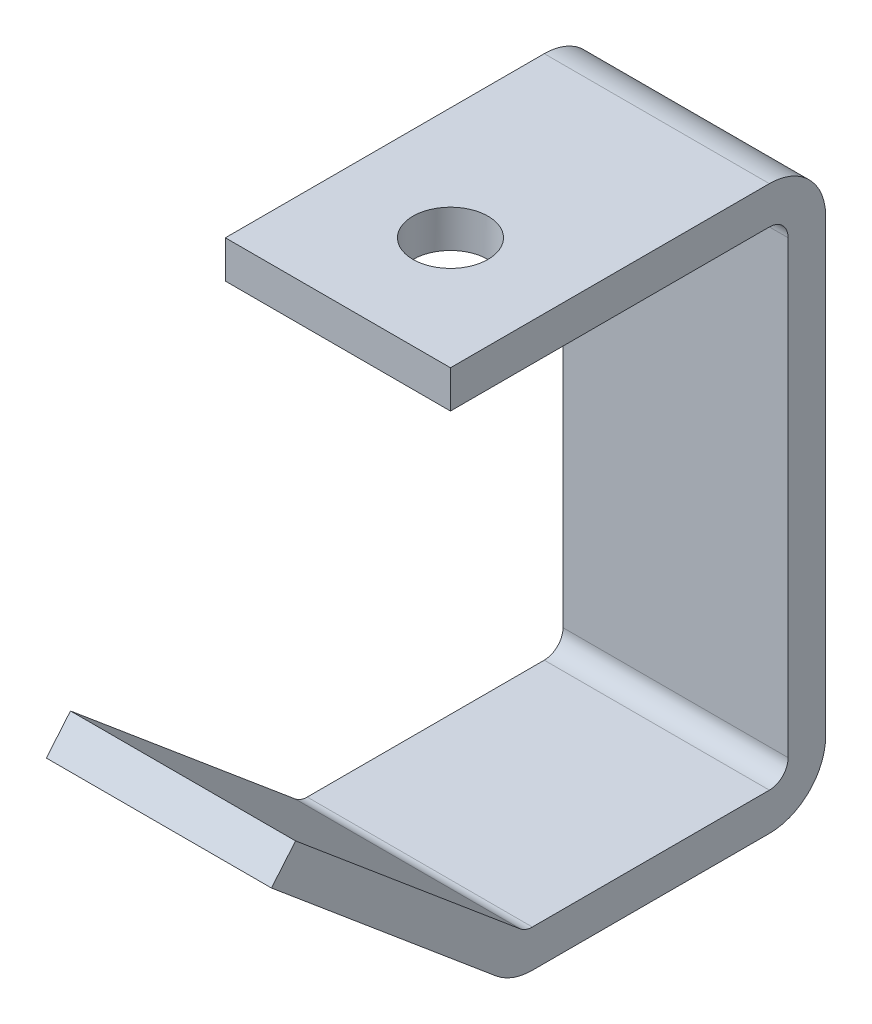
ISO-10303-21;
HEADER;
FILE_DESCRIPTION(('STEP AP214'),'2;1');
FILE_NAME('part.step','',(''),(''),'','','');
FILE_SCHEMA(('AUTOMOTIVE_DESIGN { 1 0 10303 214 1 1 1 1 }'));
ENDSEC;
DATA;
#1=APPLICATION_CONTEXT('core data for automotive mechanical design processes');
#2=APPLICATION_PROTOCOL_DEFINITION('international standard','automotive_design',2000,#1);
#3=PRODUCT_CONTEXT('',#1,'mechanical');
#4=PRODUCT('Part','Part','',(#3));
#5=PRODUCT_RELATED_PRODUCT_CATEGORY('part','',(#4));
#6=PRODUCT_DEFINITION_FORMATION('','',#4);
#7=PRODUCT_DEFINITION_CONTEXT('part definition',#1,'design');
#8=PRODUCT_DEFINITION('design','',#6,#7);
#9=PRODUCT_DEFINITION_SHAPE('','',#8);
#10=(LENGTH_UNIT() NAMED_UNIT(*) SI_UNIT(.MILLI.,.METRE.));
#11=(NAMED_UNIT(*) PLANE_ANGLE_UNIT() SI_UNIT($,.RADIAN.));
#12=(NAMED_UNIT(*) SI_UNIT($,.STERADIAN.) SOLID_ANGLE_UNIT());
#13=UNCERTAINTY_MEASURE_WITH_UNIT(LENGTH_MEASURE(1.E-05),#10,'distance_accuracy_value','');
#14=(GEOMETRIC_REPRESENTATION_CONTEXT(3) GLOBAL_UNCERTAINTY_ASSIGNED_CONTEXT((#13)) GLOBAL_UNIT_ASSIGNED_CONTEXT((#10,
#11,#12)) REPRESENTATION_CONTEXT('',''));
#15=CARTESIAN_POINT('',(0.,0.,0.));
#16=DIRECTION('',(0.,0.,1.));
#17=DIRECTION('',(1.,0.,0.));
#18=AXIS2_PLACEMENT_3D('',#15,#16,#17);
#19=CARTESIAN_POINT('',(19.05,88.9,3.175));
#20=DIRECTION('',(0.,-1.,0.));
#21=DIRECTION('',(0.,0.,-1.));
#22=AXIS2_PLACEMENT_3D('',#19,#20,#21);
#23=PLANE('',#22);
#24=CARTESIAN_POINT('',(0.,88.9,38.1));
#25=DIRECTION('',(0.,1.,0.));
#26=DIRECTION('',(0.,0.,1.));
#27=AXIS2_PLACEMENT_3D('',#24,#25,#26);
#28=CIRCLE('',#27,6.35);
#29=CARTESIAN_POINT('',(0.,88.9,44.45));
#30=VERTEX_POINT('',#29);
#31=EDGE_CURVE('E179',#30,#30,#28,.T.);
#32=ORIENTED_EDGE('',*,*,#31,.F.);
#33=EDGE_LOOP('',(#32));
#34=FACE_BOUND('',#33,.T.);
#35=DIRECTION('',(0.,0.,1.));
#36=VECTOR('',#35,1.);
#37=CARTESIAN_POINT('',(-19.05,88.9,3.175));
#38=LINE('',#37,#36);
#39=CARTESIAN_POINT('',(-19.05,88.9,3.175));
#40=VERTEX_POINT('',#39);
#41=CARTESIAN_POINT('',(-19.05,88.9,57.15));
#42=VERTEX_POINT('',#41);
#43=EDGE_CURVE('E175',#40,#42,#38,.T.);
#44=ORIENTED_EDGE('',*,*,#43,.T.);
#45=DIRECTION('',(-1.,0.,0.));
#46=VECTOR('',#45,1.);
#47=CARTESIAN_POINT('',(19.05,88.9,57.15));
#48=LINE('',#47,#46);
#49=CARTESIAN_POINT('',(19.05,88.9,57.15));
#50=VERTEX_POINT('',#49);
#51=EDGE_CURVE('E11',#50,#42,#48,.T.);
#52=ORIENTED_EDGE('',*,*,#51,.F.);
#53=DIRECTION('',(0.,0.,1.));
#54=VECTOR('',#53,1.);
#55=CARTESIAN_POINT('',(19.05,88.9,3.175));
#56=LINE('',#55,#54);
#57=CARTESIAN_POINT('',(19.05,88.9,3.175));
#58=VERTEX_POINT('',#57);
#59=EDGE_CURVE('E112',#58,#50,#56,.T.);
#60=ORIENTED_EDGE('',*,*,#59,.F.);
#61=DIRECTION('',(-1.,0.,0.));
#62=VECTOR('',#61,1.);
#63=CARTESIAN_POINT('',(19.05,88.9,3.175));
#64=LINE('',#63,#62);
#65=EDGE_CURVE('E171',#58,#40,#64,.T.);
#66=ORIENTED_EDGE('',*,*,#65,.T.);
#67=EDGE_LOOP('',(#44,#52,#60,#66));
#68=FACE_BOUND('',#67,.T.);
#69=ADVANCED_FACE('F32',(#34,#68),#23,.F.);
#70=CARTESIAN_POINT('',(19.05,82.55,57.15));
#71=DIRECTION('',(0.,0.,1.));
#72=DIRECTION('',(1.,0.,0.));
#73=AXIS2_PLACEMENT_3D('',#70,#71,#72);
#74=PLANE('',#73);
#75=DIRECTION('',(0.,1.,0.));
#76=VECTOR('',#75,1.);
#77=CARTESIAN_POINT('',(-19.05,82.55,57.15));
#78=LINE('',#77,#76);
#79=CARTESIAN_POINT('',(-19.05,82.55,57.15));
#80=VERTEX_POINT('',#79);
#81=EDGE_CURVE('E178',#80,#42,#78,.T.);
#82=ORIENTED_EDGE('',*,*,#81,.F.);
#83=DIRECTION('',(-1.,0.,0.));
#84=VECTOR('',#83,1.);
#85=CARTESIAN_POINT('',(19.05,82.55,57.15));
#86=LINE('',#85,#84);
#87=CARTESIAN_POINT('',(19.05,82.55,57.15));
#88=VERTEX_POINT('',#87);
#89=EDGE_CURVE('E40',#88,#80,#86,.T.);
#90=ORIENTED_EDGE('',*,*,#89,.F.);
#91=DIRECTION('',(0.,1.,0.));
#92=VECTOR('',#91,1.);
#93=CARTESIAN_POINT('',(19.05,82.55,57.15));
#94=LINE('',#93,#92);
#95=EDGE_CURVE('E261',#88,#50,#94,.T.);
#96=ORIENTED_EDGE('',*,*,#95,.T.);
#97=ORIENTED_EDGE('',*,*,#51,.T.);
#98=EDGE_LOOP('',(#82,#90,#96,#97));
#99=FACE_BOUND('',#98,.T.);
#100=ADVANCED_FACE('F248',(#99),#74,.T.);
#101=CARTESIAN_POINT('',(19.05,82.55,3.175));
#102=DIRECTION('',(0.,-1.,0.));
#103=DIRECTION('',(0.,0.,-1.));
#104=AXIS2_PLACEMENT_3D('',#101,#102,#103);
#105=PLANE('',#104);
#106=CARTESIAN_POINT('',(0.,82.55,38.1));
#107=DIRECTION('',(0.,-1.,0.));
#108=DIRECTION('',(0.,0.,-1.));
#109=AXIS2_PLACEMENT_3D('',#106,#107,#108);
#110=CIRCLE('',#109,6.35);
#111=CARTESIAN_POINT('',(0.,82.55,31.75));
#112=VERTEX_POINT('',#111);
#113=EDGE_CURVE('E317',#112,#112,#110,.F.);
#114=ORIENTED_EDGE('',*,*,#113,.T.);
#115=EDGE_LOOP('',(#114));
#116=FACE_BOUND('',#115,.T.);
#117=DIRECTION('',(0.,0.,1.));
#118=VECTOR('',#117,1.);
#119=CARTESIAN_POINT('',(-19.05,82.55,3.175));
#120=LINE('',#119,#118);
#121=CARTESIAN_POINT('',(-19.05,82.55,3.175));
#122=VERTEX_POINT('',#121);
#123=EDGE_CURVE('E182',#122,#80,#120,.T.);
#124=ORIENTED_EDGE('',*,*,#123,.F.);
#125=DIRECTION('',(-1.,0.,0.));
#126=VECTOR('',#125,1.);
#127=CARTESIAN_POINT('',(19.05,82.55,3.175));
#128=LINE('',#127,#126);
#129=CARTESIAN_POINT('',(19.05,82.55,3.175));
#130=VERTEX_POINT('',#129);
#131=EDGE_CURVE('E238',#130,#122,#128,.T.);
#132=ORIENTED_EDGE('',*,*,#131,.F.);
#133=DIRECTION('',(0.,0.,1.));
#134=VECTOR('',#133,1.);
#135=CARTESIAN_POINT('',(19.05,82.55,3.175));
#136=LINE('',#135,#134);
#137=EDGE_CURVE('E245',#130,#88,#136,.T.);
#138=ORIENTED_EDGE('',*,*,#137,.T.);
#139=ORIENTED_EDGE('',*,*,#89,.T.);
#140=EDGE_LOOP('',(#124,#132,#138,#139));
#141=FACE_BOUND('',#140,.T.);
#142=ADVANCED_FACE('F243',(#116,#141),#105,.T.);
#143=CARTESIAN_POINT('',(19.05,79.375,3.175));
#144=DIRECTION('',(-1.,0.,0.));
#145=DIRECTION('',(0.,0.,1.));
#146=AXIS2_PLACEMENT_3D('',#143,#144,#145);
#147=CYLINDRICAL_SURFACE('',#146,3.175);
#148=CARTESIAN_POINT('',(-19.05,79.375,3.175));
#149=DIRECTION('',(1.,0.,0.));
#150=DIRECTION('',(0.,0.,-1.));
#151=AXIS2_PLACEMENT_3D('',#148,#149,#150);
#152=CIRCLE('',#151,3.175);
#153=CARTESIAN_POINT('',(-19.05,79.375,0.));
#154=VERTEX_POINT('',#153);
#155=EDGE_CURVE('E185',#154,#122,#152,.T.);
#156=ORIENTED_EDGE('',*,*,#155,.F.);
#157=DIRECTION('',(-1.,0.,0.));
#158=VECTOR('',#157,1.);
#159=CARTESIAN_POINT('',(19.05,79.375,0.));
#160=LINE('',#159,#158);
#161=CARTESIAN_POINT('',(19.05,79.375,0.));
#162=VERTEX_POINT('',#161);
#163=EDGE_CURVE('E236',#162,#154,#160,.T.);
#164=ORIENTED_EDGE('',*,*,#163,.F.);
#165=CARTESIAN_POINT('',(19.05,79.375,3.175));
#166=DIRECTION('',(1.,0.,0.));
#167=DIRECTION('',(0.,0.,-1.));
#168=AXIS2_PLACEMENT_3D('',#165,#166,#167);
#169=CIRCLE('',#168,3.175);
#170=EDGE_CURVE('E258',#162,#130,#169,.T.);
#171=ORIENTED_EDGE('',*,*,#170,.T.);
#172=ORIENTED_EDGE('',*,*,#131,.T.);
#173=EDGE_LOOP('',(#156,#164,#171,#172));
#174=FACE_BOUND('',#173,.T.);
#175=ADVANCED_FACE('F255',(#174),#147,.F.);
#176=CARTESIAN_POINT('',(19.05,3.175,0.));
#177=DIRECTION('',(0.,0.,1.));
#178=DIRECTION('',(1.,0.,0.));
#179=AXIS2_PLACEMENT_3D('',#176,#177,#178);
#180=PLANE('',#179);
#181=DIRECTION('',(0.,1.,0.));
#182=VECTOR('',#181,1.);
#183=CARTESIAN_POINT('',(-19.05,3.175,0.));
#184=LINE('',#183,#182);
#185=CARTESIAN_POINT('',(-19.05,3.175,0.));
#186=VERTEX_POINT('',#185);
#187=EDGE_CURVE('E188',#186,#154,#184,.T.);
#188=ORIENTED_EDGE('',*,*,#187,.F.);
#189=DIRECTION('',(-1.,0.,0.));
#190=VECTOR('',#189,1.);
#191=CARTESIAN_POINT('',(19.05,3.175,0.));
#192=LINE('',#191,#190);
#193=CARTESIAN_POINT('',(19.05,3.175,0.));
#194=VERTEX_POINT('',#193);
#195=EDGE_CURVE('E234',#194,#186,#192,.T.);
#196=ORIENTED_EDGE('',*,*,#195,.F.);
#197=DIRECTION('',(0.,1.,0.));
#198=VECTOR('',#197,1.);
#199=CARTESIAN_POINT('',(19.05,3.175,0.));
#200=LINE('',#199,#198);
#201=EDGE_CURVE('E263',#194,#162,#200,.T.);
#202=ORIENTED_EDGE('',*,*,#201,.T.);
#203=ORIENTED_EDGE('',*,*,#163,.T.);
#204=EDGE_LOOP('',(#188,#196,#202,#203));
#205=FACE_BOUND('',#204,.T.);
#206=ADVANCED_FACE('F430',(#205),#180,.T.);
#207=CARTESIAN_POINT('',(19.05,3.175,3.175));
#208=DIRECTION('',(-1.,0.,0.));
#209=DIRECTION('',(0.,0.,1.));
#210=AXIS2_PLACEMENT_3D('',#207,#208,#209);
#211=CYLINDRICAL_SURFACE('',#210,3.175);
#212=CARTESIAN_POINT('',(-19.05,3.175,3.175));
#213=DIRECTION('',(1.,0.,0.));
#214=DIRECTION('',(0.,0.,1.));
#215=AXIS2_PLACEMENT_3D('',#212,#213,#214);
#216=CIRCLE('',#215,3.175);
#217=CARTESIAN_POINT('',(-19.05,0.,3.175));
#218=VERTEX_POINT('',#217);
#219=EDGE_CURVE('E191',#218,#186,#216,.T.);
#220=ORIENTED_EDGE('',*,*,#219,.F.);
#221=DIRECTION('',(-1.,0.,0.));
#222=VECTOR('',#221,1.);
#223=CARTESIAN_POINT('',(19.05,0.,3.175));
#224=LINE('',#223,#222);
#225=CARTESIAN_POINT('',(19.05,0.,3.175));
#226=VERTEX_POINT('',#225);
#227=EDGE_CURVE('E232',#226,#218,#224,.T.);
#228=ORIENTED_EDGE('',*,*,#227,.F.);
#229=CARTESIAN_POINT('',(19.05,3.175,3.175));
#230=DIRECTION('',(1.,0.,0.));
#231=DIRECTION('',(0.,0.,1.));
#232=AXIS2_PLACEMENT_3D('',#229,#230,#231);
#233=CIRCLE('',#232,3.175);
#234=EDGE_CURVE('E269',#226,#194,#233,.T.);
#235=ORIENTED_EDGE('',*,*,#234,.T.);
#236=ORIENTED_EDGE('',*,*,#195,.T.);
#237=EDGE_LOOP('',(#220,#228,#235,#236));
#238=FACE_BOUND('',#237,.T.);
#239=ADVANCED_FACE('F420',(#238),#211,.F.);
#240=CARTESIAN_POINT('',(19.05,0.,43.2943945062048));
#241=DIRECTION('',(0.,1.,0.));
#242=DIRECTION('',(0.,0.,1.));
#243=AXIS2_PLACEMENT_3D('',#240,#241,#242);
#244=PLANE('',#243);
#245=DIRECTION('',(0.,0.,-1.));
#246=VECTOR('',#245,1.);
#247=CARTESIAN_POINT('',(-19.05,0.,43.2943945062048));
#248=LINE('',#247,#246);
#249=CARTESIAN_POINT('',(-19.05,0.,43.2943945062048));
#250=VERTEX_POINT('',#249);
#251=EDGE_CURVE('E194',#250,#218,#248,.T.);
#252=ORIENTED_EDGE('',*,*,#251,.F.);
#253=DIRECTION('',(-1.,0.,0.));
#254=VECTOR('',#253,1.);
#255=CARTESIAN_POINT('',(19.05,0.,43.2943945062048));
#256=LINE('',#255,#254);
#257=CARTESIAN_POINT('',(19.05,0.,43.2943945062048));
#258=VERTEX_POINT('',#257);
#259=EDGE_CURVE('E230',#258,#250,#256,.T.);
#260=ORIENTED_EDGE('',*,*,#259,.F.);
#261=DIRECTION('',(0.,0.,-1.));
#262=VECTOR('',#261,1.);
#263=CARTESIAN_POINT('',(19.05,0.,43.2943945062048));
#264=LINE('',#263,#262);
#265=EDGE_CURVE('E272',#258,#226,#264,.T.);
#266=ORIENTED_EDGE('',*,*,#265,.T.);
#267=ORIENTED_EDGE('',*,*,#227,.T.);
#268=EDGE_LOOP('',(#252,#260,#266,#267));
#269=FACE_BOUND('',#268,.T.);
#270=ADVANCED_FACE('F410',(#269),#244,.T.);
#271=CARTESIAN_POINT('',(19.05,3.175,43.2943945062048));
#272=DIRECTION('',(-1.,0.,0.));
#273=DIRECTION('',(0.,0.,1.));
#274=AXIS2_PLACEMENT_3D('',#271,#272,#273);
#275=CYLINDRICAL_SURFACE('',#274,3.175);
#276=CARTESIAN_POINT('',(-19.05,3.175,43.2943945062048));
#277=DIRECTION('',(1.,0.,0.));
#278=DIRECTION('',(0.,0.,-1.));
#279=AXIS2_PLACEMENT_3D('',#276,#277,#278);
#280=CIRCLE('',#279,3.175);
#281=CARTESIAN_POINT('',(-19.05,0.742808893097249,45.3352451669596));
#282=VERTEX_POINT('',#281);
#283=EDGE_CURVE('E197',#282,#250,#280,.T.);
#284=ORIENTED_EDGE('',*,*,#283,.F.);
#285=DIRECTION('',(-1.,0.,0.));
#286=VECTOR('',#285,1.);
#287=CARTESIAN_POINT('',(19.05,0.742808893097249,45.3352451669596));
#288=LINE('',#287,#286);
#289=CARTESIAN_POINT('',(19.05,0.742808893097249,45.3352451669596));
#290=VERTEX_POINT('',#289);
#291=EDGE_CURVE('E228',#290,#282,#288,.T.);
#292=ORIENTED_EDGE('',*,*,#291,.F.);
#293=CARTESIAN_POINT('',(19.05,3.175,43.2943945062048));
#294=DIRECTION('',(1.,0.,0.));
#295=DIRECTION('',(0.,0.,-1.));
#296=AXIS2_PLACEMENT_3D('',#293,#294,#295);
#297=CIRCLE('',#296,3.175);
#298=EDGE_CURVE('E275',#290,#258,#297,.T.);
#299=ORIENTED_EDGE('',*,*,#298,.T.);
#300=ORIENTED_EDGE('',*,*,#259,.T.);
#301=EDGE_LOOP('',(#284,#292,#299,#300));
#302=FACE_BOUND('',#301,.T.);
#303=ADVANCED_FACE('F400',(#302),#275,.F.);
#304=CARTESIAN_POINT('',(19.05,32.6536105720763,83.365057710444));
#305=DIRECTION('',(0.,0.766044443118977,-0.642787609686541));
#306=DIRECTION('',(0.,0.64278760968654,0.766044443118977));
#307=AXIS2_PLACEMENT_3D('',#304,#305,#306);
#308=PLANE('',#307);
#309=DIRECTION('',(0.,-0.64278760968654,-0.766044443118977));
#310=VECTOR('',#309,1.);
#311=CARTESIAN_POINT('',(-19.05,32.6536105720763,83.365057710444));
#312=LINE('',#311,#310);
#313=CARTESIAN_POINT('',(-19.05,32.6536105720763,83.365057710444));
#314=VERTEX_POINT('',#313);
#315=EDGE_CURVE('E200',#314,#282,#312,.T.);
#316=ORIENTED_EDGE('',*,*,#315,.F.);
#317=DIRECTION('',(-1.,0.,0.));
#318=VECTOR('',#317,1.);
#319=CARTESIAN_POINT('',(19.05,32.6536105720763,83.365057710444));
#320=LINE('',#319,#318);
#321=CARTESIAN_POINT('',(19.05,32.6536105720763,83.365057710444));
#322=VERTEX_POINT('',#321);
#323=EDGE_CURVE('E226',#322,#314,#320,.T.);
#324=ORIENTED_EDGE('',*,*,#323,.F.);
#325=DIRECTION('',(0.,-0.64278760968654,-0.766044443118977));
#326=VECTOR('',#325,1.);
#327=CARTESIAN_POINT('',(19.05,32.6536105720763,83.365057710444));
#328=LINE('',#327,#326);
#329=EDGE_CURVE('E278',#322,#290,#328,.T.);
#330=ORIENTED_EDGE('',*,*,#329,.T.);
#331=ORIENTED_EDGE('',*,*,#291,.T.);
#332=EDGE_LOOP('',(#316,#324,#330,#331));
#333=FACE_BOUND('',#332,.T.);
#334=ADVANCED_FACE('F390',(#333),#308,.T.);
#335=CARTESIAN_POINT('',(19.05,27.7892283582707,87.4467590319536));
#336=DIRECTION('',(0.,0.642787609686541,0.766044443118977));
#337=DIRECTION('',(0.,-0.766044443118977,0.642787609686541));
#338=AXIS2_PLACEMENT_3D('',#335,#336,#337);
#339=PLANE('',#338);
#340=DIRECTION('',(0.,0.766044443118977,-0.642787609686541));
#341=VECTOR('',#340,1.);
#342=CARTESIAN_POINT('',(-19.05,27.7892283582707,87.4467590319536));
#343=LINE('',#342,#341);
#344=CARTESIAN_POINT('',(-19.05,27.7892283582707,87.4467590319536));
#345=VERTEX_POINT('',#344);
#346=EDGE_CURVE('E203',#345,#314,#343,.T.);
#347=ORIENTED_EDGE('',*,*,#346,.F.);
#348=DIRECTION('',(-1.,0.,0.));
#349=VECTOR('',#348,1.);
#350=CARTESIAN_POINT('',(19.05,27.7892283582707,87.4467590319536));
#351=LINE('',#350,#349);
#352=CARTESIAN_POINT('',(19.05,27.7892283582707,87.4467590319536));
#353=VERTEX_POINT('',#352);
#354=EDGE_CURVE('E224',#353,#345,#351,.T.);
#355=ORIENTED_EDGE('',*,*,#354,.F.);
#356=DIRECTION('',(0.,0.766044443118977,-0.642787609686541));
#357=VECTOR('',#356,1.);
#358=CARTESIAN_POINT('',(19.05,27.7892283582707,87.4467590319536));
#359=LINE('',#358,#357);
#360=EDGE_CURVE('E281',#353,#322,#359,.T.);
#361=ORIENTED_EDGE('',*,*,#360,.T.);
#362=ORIENTED_EDGE('',*,*,#323,.T.);
#363=EDGE_LOOP('',(#347,#355,#361,#362));
#364=FACE_BOUND('',#363,.T.);
#365=ADVANCED_FACE('F380',(#364),#339,.T.);
#366=CARTESIAN_POINT('',(19.05,27.7892283582707,87.4467590319536));
#367=DIRECTION('',(0.,0.766044443118977,-0.64278760968654));
#368=DIRECTION('',(0.,0.642787609686541,0.766044443118977));
#369=AXIS2_PLACEMENT_3D('',#366,#367,#368);
#370=PLANE('',#369);
#371=DIRECTION('',(0.,-0.642787609686541,-0.766044443118977));
#372=VECTOR('',#371,1.);
#373=CARTESIAN_POINT('',(-19.05,27.7892283582707,87.4467590319536));
#374=LINE('',#373,#372);
#375=CARTESIAN_POINT('',(-19.05,-4.12157332070825,49.4169464884691));
#376=VERTEX_POINT('',#375);
#377=EDGE_CURVE('E206',#345,#376,#374,.T.);
#378=ORIENTED_EDGE('',*,*,#377,.T.);
#379=DIRECTION('',(-1.,0.,0.));
#380=VECTOR('',#379,1.);
#381=CARTESIAN_POINT('',(19.05,-4.12157332070825,49.4169464884691));
#382=LINE('',#381,#380);
#383=CARTESIAN_POINT('',(19.05,-4.12157332070825,49.4169464884691));
#384=VERTEX_POINT('',#383);
#385=EDGE_CURVE('E221',#384,#376,#382,.T.);
#386=ORIENTED_EDGE('',*,*,#385,.F.);
#387=DIRECTION('',(0.,-0.642787609686541,-0.766044443118977));
#388=VECTOR('',#387,1.);
#389=CARTESIAN_POINT('',(19.05,27.7892283582707,87.4467590319536));
#390=LINE('',#389,#388);
#391=EDGE_CURVE('E284',#353,#384,#390,.T.);
#392=ORIENTED_EDGE('',*,*,#391,.F.);
#393=ORIENTED_EDGE('',*,*,#354,.T.);
#394=EDGE_LOOP('',(#378,#386,#392,#393));
#395=FACE_BOUND('',#394,.T.);
#396=ADVANCED_FACE('F371',(#395),#370,.F.);
#397=CARTESIAN_POINT('',(19.05,3.175,43.2943945062048));
#398=DIRECTION('',(-1.,0.,0.));
#399=DIRECTION('',(0.,0.,1.));
#400=AXIS2_PLACEMENT_3D('',#397,#398,#399);
#401=CYLINDRICAL_SURFACE('',#400,9.525);
#402=CARTESIAN_POINT('',(-19.05,3.175,43.2943945062048));
#403=DIRECTION('',(1.,0.,0.));
#404=DIRECTION('',(0.,0.,-1.));
#405=AXIS2_PLACEMENT_3D('',#402,#403,#404);
#406=CIRCLE('',#405,9.525);
#407=CARTESIAN_POINT('',(-19.05,-6.35,43.2943945062048));
#408=VERTEX_POINT('',#407);
#409=EDGE_CURVE('E208',#376,#408,#406,.T.);
#410=ORIENTED_EDGE('',*,*,#409,.T.);
#411=DIRECTION('',(-1.,0.,0.));
#412=VECTOR('',#411,1.);
#413=CARTESIAN_POINT('',(19.05,-6.35,43.2943945062048));
#414=LINE('',#413,#412);
#415=CARTESIAN_POINT('',(19.05,-6.35,43.2943945062048));
#416=VERTEX_POINT('',#415);
#417=EDGE_CURVE('E218',#416,#408,#414,.T.);
#418=ORIENTED_EDGE('',*,*,#417,.F.);
#419=CARTESIAN_POINT('',(19.05,3.175,43.2943945062048));
#420=DIRECTION('',(1.,0.,0.));
#421=DIRECTION('',(0.,0.,-1.));
#422=AXIS2_PLACEMENT_3D('',#419,#420,#421);
#423=CIRCLE('',#422,9.525);
#424=EDGE_CURVE('E286',#384,#416,#423,.T.);
#425=ORIENTED_EDGE('',*,*,#424,.F.);
#426=ORIENTED_EDGE('',*,*,#385,.T.);
#427=EDGE_LOOP('',(#410,#418,#425,#426));
#428=FACE_BOUND('',#427,.T.);
#429=ADVANCED_FACE('F293',(#428),#401,.T.);
#430=CARTESIAN_POINT('',(19.05,-6.35,43.2943945062048));
#431=DIRECTION('',(0.,1.,0.));
#432=DIRECTION('',(0.,0.,1.));
#433=AXIS2_PLACEMENT_3D('',#430,#431,#432);
#434=PLANE('',#433);
#435=DIRECTION('',(0.,0.,-1.));
#436=VECTOR('',#435,1.);
#437=CARTESIAN_POINT('',(-19.05,-6.35,43.2943945062048));
#438=LINE('',#437,#436);
#439=CARTESIAN_POINT('',(-19.05,-6.35,3.17499999999999));
#440=VERTEX_POINT('',#439);
#441=EDGE_CURVE('E210',#408,#440,#438,.T.);
#442=ORIENTED_EDGE('',*,*,#441,.T.);
#443=DIRECTION('',(-1.,0.,0.));
#444=VECTOR('',#443,1.);
#445=CARTESIAN_POINT('',(19.05,-6.35,3.17499999999999));
#446=LINE('',#445,#444);
#447=CARTESIAN_POINT('',(19.05,-6.35,3.17499999999999));
#448=VERTEX_POINT('',#447);
#449=EDGE_CURVE('E166',#448,#440,#446,.T.);
#450=ORIENTED_EDGE('',*,*,#449,.F.);
#451=DIRECTION('',(0.,0.,-1.));
#452=VECTOR('',#451,1.);
#453=CARTESIAN_POINT('',(19.05,-6.35,43.2943945062048));
#454=LINE('',#453,#452);
#455=EDGE_CURVE('E157',#416,#448,#454,.T.);
#456=ORIENTED_EDGE('',*,*,#455,.F.);
#457=ORIENTED_EDGE('',*,*,#417,.T.);
#458=EDGE_LOOP('',(#442,#450,#456,#457));
#459=FACE_BOUND('',#458,.T.);
#460=ADVANCED_FACE('F297',(#459),#434,.F.);
#461=CARTESIAN_POINT('',(19.05,3.175,3.175));
#462=DIRECTION('',(-1.,0.,0.));
#463=DIRECTION('',(0.,0.,1.));
#464=AXIS2_PLACEMENT_3D('',#461,#462,#463);
#465=CYLINDRICAL_SURFACE('',#464,9.525);
#466=CARTESIAN_POINT('',(-19.05,3.175,3.175));
#467=DIRECTION('',(1.,0.,0.));
#468=DIRECTION('',(0.,0.,-1.));
#469=AXIS2_PLACEMENT_3D('',#466,#467,#468);
#470=CIRCLE('',#469,9.525);
#471=CARTESIAN_POINT('',(-19.05,3.175,-6.35));
#472=VERTEX_POINT('',#471);
#473=EDGE_CURVE('E165',#440,#472,#470,.T.);
#474=ORIENTED_EDGE('',*,*,#473,.T.);
#475=DIRECTION('',(-1.,0.,0.));
#476=VECTOR('',#475,1.);
#477=CARTESIAN_POINT('',(19.05,3.175,-6.35));
#478=LINE('',#477,#476);
#479=CARTESIAN_POINT('',(19.05,3.175,-6.35));
#480=VERTEX_POINT('',#479);
#481=EDGE_CURVE('E162',#480,#472,#478,.T.);
#482=ORIENTED_EDGE('',*,*,#481,.F.);
#483=CARTESIAN_POINT('',(19.05,3.175,3.175));
#484=DIRECTION('',(1.,0.,0.));
#485=DIRECTION('',(0.,0.,-1.));
#486=AXIS2_PLACEMENT_3D('',#483,#484,#485);
#487=CIRCLE('',#486,9.525);
#488=EDGE_CURVE('E151',#448,#480,#487,.T.);
#489=ORIENTED_EDGE('',*,*,#488,.F.);
#490=ORIENTED_EDGE('',*,*,#449,.T.);
#491=EDGE_LOOP('',(#474,#482,#489,#490));
#492=FACE_BOUND('',#491,.T.);
#493=ADVANCED_FACE('F163',(#492),#465,.T.);
#494=CARTESIAN_POINT('',(19.05,3.175,-6.35));
#495=DIRECTION('',(0.,0.,1.));
#496=DIRECTION('',(1.,0.,0.));
#497=AXIS2_PLACEMENT_3D('',#494,#495,#496);
#498=PLANE('',#497);
#499=DIRECTION('',(0.,1.,0.));
#500=VECTOR('',#499,1.);
#501=CARTESIAN_POINT('',(-19.05,3.175,-6.35));
#502=LINE('',#501,#500);
#503=CARTESIAN_POINT('',(-19.05,79.375,-6.35));
#504=VERTEX_POINT('',#503);
#505=EDGE_CURVE('E100',#472,#504,#502,.T.);
#506=ORIENTED_EDGE('',*,*,#505,.T.);
#507=DIRECTION('',(-1.,0.,0.));
#508=VECTOR('',#507,1.);
#509=CARTESIAN_POINT('',(19.05,79.375,-6.35));
#510=LINE('',#509,#508);
#511=CARTESIAN_POINT('',(19.05,79.375,-6.35));
#512=VERTEX_POINT('',#511);
#513=EDGE_CURVE('E167',#512,#504,#510,.T.);
#514=ORIENTED_EDGE('',*,*,#513,.F.);
#515=DIRECTION('',(0.,1.,0.));
#516=VECTOR('',#515,1.);
#517=CARTESIAN_POINT('',(19.05,3.175,-6.35));
#518=LINE('',#517,#516);
#519=EDGE_CURVE('E155',#480,#512,#518,.T.);
#520=ORIENTED_EDGE('',*,*,#519,.F.);
#521=ORIENTED_EDGE('',*,*,#481,.T.);
#522=EDGE_LOOP('',(#506,#514,#520,#521));
#523=FACE_BOUND('',#522,.T.);
#524=ADVANCED_FACE('F169',(#523),#498,.F.);
#525=CARTESIAN_POINT('',(19.05,79.375,3.175));
#526=DIRECTION('',(-1.,0.,0.));
#527=DIRECTION('',(0.,0.,1.));
#528=AXIS2_PLACEMENT_3D('',#525,#526,#527);
#529=CYLINDRICAL_SURFACE('',#528,9.525);
#530=CARTESIAN_POINT('',(-19.05,79.375,3.175));
#531=DIRECTION('',(1.,0.,0.));
#532=DIRECTION('',(0.,0.,-1.));
#533=AXIS2_PLACEMENT_3D('',#530,#531,#532);
#534=CIRCLE('',#533,9.525);
#535=EDGE_CURVE('E106',#504,#40,#534,.T.);
#536=ORIENTED_EDGE('',*,*,#535,.T.);
#537=ORIENTED_EDGE('',*,*,#65,.F.);
#538=CARTESIAN_POINT('',(19.05,79.375,3.175));
#539=DIRECTION('',(1.,0.,0.));
#540=DIRECTION('',(0.,0.,-1.));
#541=AXIS2_PLACEMENT_3D('',#538,#539,#540);
#542=CIRCLE('',#541,9.525);
#543=EDGE_CURVE('E48',#512,#58,#542,.T.);
#544=ORIENTED_EDGE('',*,*,#543,.F.);
#545=ORIENTED_EDGE('',*,*,#513,.T.);
#546=EDGE_LOOP('',(#536,#537,#544,#545));
#547=FACE_BOUND('',#546,.T.);
#548=ADVANCED_FACE('F299',(#547),#529,.T.);
#549=CARTESIAN_POINT('',(19.05,79.375,3.175));
#550=DIRECTION('',(1.,0.,0.));
#551=DIRECTION('',(0.,0.,-1.));
#552=AXIS2_PLACEMENT_3D('',#549,#550,#551);
#553=PLANE('',#552);
#554=ORIENTED_EDGE('',*,*,#59,.T.);
#555=ORIENTED_EDGE('',*,*,#95,.F.);
#556=ORIENTED_EDGE('',*,*,#137,.F.);
#557=ORIENTED_EDGE('',*,*,#170,.F.);
#558=ORIENTED_EDGE('',*,*,#201,.F.);
#559=ORIENTED_EDGE('',*,*,#234,.F.);
#560=ORIENTED_EDGE('',*,*,#265,.F.);
#561=ORIENTED_EDGE('',*,*,#298,.F.);
#562=ORIENTED_EDGE('',*,*,#329,.F.);
#563=ORIENTED_EDGE('',*,*,#360,.F.);
#564=ORIENTED_EDGE('',*,*,#391,.T.);
#565=ORIENTED_EDGE('',*,*,#424,.T.);
#566=ORIENTED_EDGE('',*,*,#455,.T.);
#567=ORIENTED_EDGE('',*,*,#488,.T.);
#568=ORIENTED_EDGE('',*,*,#519,.T.);
#569=ORIENTED_EDGE('',*,*,#543,.T.);
#570=EDGE_LOOP('',(#554,#555,#556,#557,#558,#559,#560,#561,#562,#563,#564,#565,#566,#567,#568,#569));
#571=FACE_BOUND('',#570,.T.);
#572=ADVANCED_FACE('F153',(#571),#553,.T.);
#573=CARTESIAN_POINT('',(-19.05,79.375,3.175));
#574=DIRECTION('',(1.,0.,0.));
#575=DIRECTION('',(0.,0.,-1.));
#576=AXIS2_PLACEMENT_3D('',#573,#574,#575);
#577=PLANE('',#576);
#578=ORIENTED_EDGE('',*,*,#43,.F.);
#579=ORIENTED_EDGE('',*,*,#535,.F.);
#580=ORIENTED_EDGE('',*,*,#505,.F.);
#581=ORIENTED_EDGE('',*,*,#473,.F.);
#582=ORIENTED_EDGE('',*,*,#441,.F.);
#583=ORIENTED_EDGE('',*,*,#409,.F.);
#584=ORIENTED_EDGE('',*,*,#377,.F.);
#585=ORIENTED_EDGE('',*,*,#346,.T.);
#586=ORIENTED_EDGE('',*,*,#315,.T.);
#587=ORIENTED_EDGE('',*,*,#283,.T.);
#588=ORIENTED_EDGE('',*,*,#251,.T.);
#589=ORIENTED_EDGE('',*,*,#219,.T.);
#590=ORIENTED_EDGE('',*,*,#187,.T.);
#591=ORIENTED_EDGE('',*,*,#155,.T.);
#592=ORIENTED_EDGE('',*,*,#123,.T.);
#593=ORIENTED_EDGE('',*,*,#81,.T.);
#594=EDGE_LOOP('',(#578,#579,#580,#581,#582,#583,#584,#585,#586,#587,#588,#589,#590,#591,#592,#593));
#595=FACE_BOUND('',#594,.T.);
#596=ADVANCED_FACE('F251',(#595),#577,.F.);
#597=CARTESIAN_POINT('',(0.,-6.35100000000002,38.1000000000001));
#598=DIRECTION('',(0.,1.,0.));
#599=DIRECTION('',(0.,0.,1.));
#600=AXIS2_PLACEMENT_3D('',#597,#598,#599);
#601=CYLINDRICAL_SURFACE('',#600,6.35);
#602=ORIENTED_EDGE('',*,*,#113,.F.);
#603=EDGE_LOOP('',(#602));
#604=FACE_BOUND('',#603,.T.);
#605=ORIENTED_EDGE('',*,*,#31,.T.);
#606=EDGE_LOOP('',(#605));
#607=FACE_BOUND('',#606,.T.);
#608=ADVANCED_FACE('F324',(#604,#607),#601,.F.);
#609=CLOSED_SHELL('',(#69,#100,#142,#175,#206,#239,#270,#303,#334,#365,#396,#429,#460,#493,#524,
#548,#572,#596,#608));
#610=MANIFOLD_SOLID_BREP('B2',#609);
#611=ADVANCED_BREP_SHAPE_REPRESENTATION('',(#18,#610),#14);
#612=SHAPE_DEFINITION_REPRESENTATION(#9,#611);
ENDSEC;
END-ISO-10303-21;
